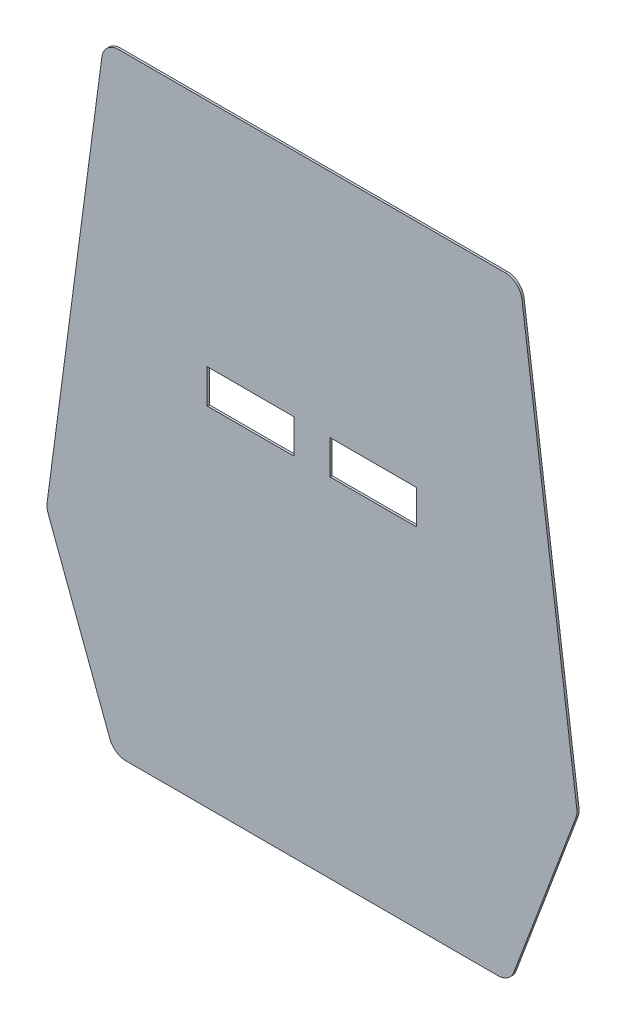
ISO-10303-21;
HEADER;
FILE_DESCRIPTION(('STEP AP214'),'2;1');
FILE_NAME('part.step','',(''),(''),'','','');
FILE_SCHEMA(('AUTOMOTIVE_DESIGN { 1 0 10303 214 1 1 1 1 }'));
ENDSEC;
DATA;
#1=APPLICATION_CONTEXT('core data for automotive mechanical design processes');
#2=APPLICATION_PROTOCOL_DEFINITION('international standard','automotive_design',2000,#1);
#3=PRODUCT_CONTEXT('',#1,'mechanical');
#4=PRODUCT('Part','Part','',(#3));
#5=PRODUCT_RELATED_PRODUCT_CATEGORY('part','',(#4));
#6=PRODUCT_DEFINITION_FORMATION('','',#4);
#7=PRODUCT_DEFINITION_CONTEXT('part definition',#1,'design');
#8=PRODUCT_DEFINITION('design','',#6,#7);
#9=PRODUCT_DEFINITION_SHAPE('','',#8);
#10=(LENGTH_UNIT() NAMED_UNIT(*) SI_UNIT(.MILLI.,.METRE.));
#11=(NAMED_UNIT(*) PLANE_ANGLE_UNIT() SI_UNIT($,.RADIAN.));
#12=(NAMED_UNIT(*) SI_UNIT($,.STERADIAN.) SOLID_ANGLE_UNIT());
#13=UNCERTAINTY_MEASURE_WITH_UNIT(LENGTH_MEASURE(1.E-05),#10,'distance_accuracy_value','');
#14=(GEOMETRIC_REPRESENTATION_CONTEXT(3) GLOBAL_UNCERTAINTY_ASSIGNED_CONTEXT((#13)) GLOBAL_UNIT_ASSIGNED_CONTEXT((#10,
#11,#12)) REPRESENTATION_CONTEXT('',''));
#15=CARTESIAN_POINT('',(0.,0.,0.));
#16=DIRECTION('',(0.,0.,1.));
#17=DIRECTION('',(1.,0.,0.));
#18=AXIS2_PLACEMENT_3D('',#15,#16,#17);
#19=CARTESIAN_POINT('',(0.,0.,-3.175));
#20=DIRECTION('',(0.,0.,1.));
#21=DIRECTION('',(1.,0.,0.));
#22=AXIS2_PLACEMENT_3D('',#19,#20,#21);
#23=PLANE('',#22);
#24=DIRECTION('',(0.352233761299135,-0.935912056446045,0.));
#25=VECTOR('',#24,1.);
#26=CARTESIAN_POINT('',(-389.09,263.21,-3.175));
#27=LINE('',#26,#25);
#28=CARTESIAN_POINT('',(-386.880452975,257.339064481626,-3.175));
#29=VERTEX_POINT('',#28);
#30=CARTESIAN_POINT('',(-296.124726986599,16.1941559675215,-3.175));
#31=VERTEX_POINT('',#30);
#32=EDGE_CURVE('E384',#29,#31,#27,.T.);
#33=ORIENTED_EDGE('',*,*,#32,.F.);
#34=CARTESIAN_POINT('',(-363.482651563849,266.144908514104,-3.175));
#35=DIRECTION('',(0.,0.,1.));
#36=DIRECTION('',(1.,0.,0.));
#37=AXIS2_PLACEMENT_3D('',#34,#35,#36);
#38=CIRCLE('',#37,25.);
#39=CARTESIAN_POINT('',(-388.266059479813,269.428609485712,-3.175));
#40=VERTEX_POINT('',#39);
#41=EDGE_CURVE('E435',#29,#40,#38,.F.);
#42=ORIENTED_EDGE('',*,*,#41,.T.);
#43=DIRECTION('',(-0.131348038864326,-0.991336316638554,0.));
#44=VECTOR('',#43,1.);
#45=CARTESIAN_POINT('',(-305.02,897.72,-3.175));
#46=LINE('',#45,#44);
#47=CARTESIAN_POINT('',(-307.897321491099,876.003700971608,-3.175));
#48=VERTEX_POINT('',#47);
#49=EDGE_CURVE('E381',#48,#40,#46,.T.);
#50=ORIENTED_EDGE('',*,*,#49,.F.);
#51=CARTESIAN_POINT('',(-283.113913575135,872.72,-3.175));
#52=DIRECTION('',(0.,0.,1.));
#53=DIRECTION('',(1.,0.,0.));
#54=AXIS2_PLACEMENT_3D('',#51,#52,#53);
#55=CIRCLE('',#54,25.);
#56=CARTESIAN_POINT('',(-283.113913575135,897.72,-3.175));
#57=VERTEX_POINT('',#56);
#58=EDGE_CURVE('E425',#48,#57,#55,.F.);
#59=ORIENTED_EDGE('',*,*,#58,.T.);
#60=DIRECTION('',(-1.,0.,0.));
#61=VECTOR('',#60,1.);
#62=CARTESIAN_POINT('',(-305.02,897.72,-3.175));
#63=LINE('',#62,#61);
#64=CARTESIAN_POINT('',(283.113913575135,897.72,-3.175));
#65=VERTEX_POINT('',#64);
#66=EDGE_CURVE('E378',#65,#57,#63,.T.);
#67=ORIENTED_EDGE('',*,*,#66,.F.);
#68=CARTESIAN_POINT('',(283.113913575135,872.72,-3.175));
#69=DIRECTION('',(0.,0.,1.));
#70=DIRECTION('',(1.,0.,0.));
#71=AXIS2_PLACEMENT_3D('',#68,#69,#70);
#72=CIRCLE('',#71,25.);
#73=CARTESIAN_POINT('',(307.897321491099,876.003700971608,-3.175));
#74=VERTEX_POINT('',#73);
#75=EDGE_CURVE('E427',#65,#74,#72,.F.);
#76=ORIENTED_EDGE('',*,*,#75,.T.);
#77=DIRECTION('',(-0.131348038864326,0.991336316638554,0.));
#78=VECTOR('',#77,1.);
#79=CARTESIAN_POINT('',(305.02,897.72,-3.175));
#80=LINE('',#79,#78);
#81=CARTESIAN_POINT('',(388.266059479813,269.428609485712,-3.175));
#82=VERTEX_POINT('',#81);
#83=EDGE_CURVE('E375',#82,#74,#80,.T.);
#84=ORIENTED_EDGE('',*,*,#83,.F.);
#85=CARTESIAN_POINT('',(363.482651563849,266.144908514104,-3.175));
#86=DIRECTION('',(0.,0.,1.));
#87=DIRECTION('',(1.,0.,0.));
#88=AXIS2_PLACEMENT_3D('',#85,#86,#87);
#89=CIRCLE('',#88,25.);
#90=CARTESIAN_POINT('',(386.880452975,257.339064481626,-3.175));
#91=VERTEX_POINT('',#90);
#92=EDGE_CURVE('E429',#82,#91,#89,.F.);
#93=ORIENTED_EDGE('',*,*,#92,.T.);
#94=DIRECTION('',(0.352233761299134,0.935912056446045,0.));
#95=VECTOR('',#94,1.);
#96=CARTESIAN_POINT('',(389.09,263.21,-3.175));
#97=LINE('',#96,#95);
#98=CARTESIAN_POINT('',(296.124726986599,16.1941559675215,-3.175));
#99=VERTEX_POINT('',#98);
#100=EDGE_CURVE('E371',#99,#91,#97,.T.);
#101=ORIENTED_EDGE('',*,*,#100,.F.);
#102=CARTESIAN_POINT('',(272.726925575448,25.,-3.175));
#103=DIRECTION('',(0.,0.,1.));
#104=DIRECTION('',(1.,0.,0.));
#105=AXIS2_PLACEMENT_3D('',#102,#103,#104);
#106=CIRCLE('',#105,25.);
#107=CARTESIAN_POINT('',(272.726925575448,0.,-3.175));
#108=VERTEX_POINT('',#107);
#109=EDGE_CURVE('E431',#99,#108,#106,.F.);
#110=ORIENTED_EDGE('',*,*,#109,.T.);
#111=DIRECTION('',(1.,0.,0.));
#112=VECTOR('',#111,1.);
#113=CARTESIAN_POINT('',(290.03,0.,-3.175));
#114=LINE('',#113,#112);
#115=CARTESIAN_POINT('',(-272.726925575448,-1.08903286991572E-13,-3.175));
#116=VERTEX_POINT('',#115);
#117=EDGE_CURVE('E368',#116,#108,#114,.T.);
#118=ORIENTED_EDGE('',*,*,#117,.F.);
#119=CARTESIAN_POINT('',(-272.726925575448,24.9999999999999,-3.175));
#120=DIRECTION('',(0.,0.,1.));
#121=DIRECTION('',(1.,0.,0.));
#122=AXIS2_PLACEMENT_3D('',#119,#120,#121);
#123=CIRCLE('',#122,25.);
#124=EDGE_CURVE('E433',#116,#31,#123,.F.);
#125=ORIENTED_EDGE('',*,*,#124,.T.);
#126=EDGE_LOOP('',(#33,#42,#50,#59,#67,#76,#84,#93,#101,#110,#118,#125));
#127=FACE_BOUND('',#126,.T.);
#128=DIRECTION('',(1.,0.,0.));
#129=VECTOR('',#128,1.);
#130=CARTESIAN_POINT('',(0.,510.,-3.175));
#131=LINE('',#130,#129);
#132=CARTESIAN_POINT('',(26.5000000000002,510.,-3.175));
#133=VERTEX_POINT('',#132);
#134=CARTESIAN_POINT('',(153.5,510.,-3.175));
#135=VERTEX_POINT('',#134);
#136=EDGE_CURVE('E349',#133,#135,#131,.T.);
#137=ORIENTED_EDGE('',*,*,#136,.T.);
#138=DIRECTION('',(0.,1.,0.));
#139=VECTOR('',#138,1.);
#140=CARTESIAN_POINT('',(153.5,0.,-3.175));
#141=LINE('',#140,#139);
#142=CARTESIAN_POINT('',(153.5,560.,-3.175));
#143=VERTEX_POINT('',#142);
#144=EDGE_CURVE('E352',#135,#143,#141,.T.);
#145=ORIENTED_EDGE('',*,*,#144,.T.);
#146=DIRECTION('',(-1.,0.,0.));
#147=VECTOR('',#146,1.);
#148=CARTESIAN_POINT('',(0.,560.,-3.175));
#149=LINE('',#148,#147);
#150=CARTESIAN_POINT('',(26.5000000000002,560.,-3.175));
#151=VERTEX_POINT('',#150);
#152=EDGE_CURVE('E319',#143,#151,#149,.T.);
#153=ORIENTED_EDGE('',*,*,#152,.T.);
#154=DIRECTION('',(0.,-1.,0.));
#155=VECTOR('',#154,1.);
#156=CARTESIAN_POINT('',(26.5000000000003,0.,-3.175));
#157=LINE('',#156,#155);
#158=EDGE_CURVE('E346',#151,#133,#157,.T.);
#159=ORIENTED_EDGE('',*,*,#158,.T.);
#160=EDGE_LOOP('',(#137,#145,#153,#159));
#161=FACE_BOUND('',#160,.T.);
#162=DIRECTION('',(1.,0.,0.));
#163=VECTOR('',#162,1.);
#164=CARTESIAN_POINT('',(0.,510.,-3.175));
#165=LINE('',#164,#163);
#166=CARTESIAN_POINT('',(-153.5,510.,-3.175));
#167=VERTEX_POINT('',#166);
#168=CARTESIAN_POINT('',(-26.5,510.,-3.175));
#169=VERTEX_POINT('',#168);
#170=EDGE_CURVE('E361',#167,#169,#165,.T.);
#171=ORIENTED_EDGE('',*,*,#170,.T.);
#172=DIRECTION('',(0.,1.,0.));
#173=VECTOR('',#172,1.);
#174=CARTESIAN_POINT('',(-26.5,0.,-3.175));
#175=LINE('',#174,#173);
#176=CARTESIAN_POINT('',(-26.5,560.,-3.175));
#177=VERTEX_POINT('',#176);
#178=EDGE_CURVE('E364',#169,#177,#175,.T.);
#179=ORIENTED_EDGE('',*,*,#178,.T.);
#180=DIRECTION('',(-1.,0.,0.));
#181=VECTOR('',#180,1.);
#182=CARTESIAN_POINT('',(0.,560.,-3.175));
#183=LINE('',#182,#181);
#184=CARTESIAN_POINT('',(-153.5,560.,-3.175));
#185=VERTEX_POINT('',#184);
#186=EDGE_CURVE('E355',#177,#185,#183,.T.);
#187=ORIENTED_EDGE('',*,*,#186,.T.);
#188=DIRECTION('',(0.,-1.,0.));
#189=VECTOR('',#188,1.);
#190=CARTESIAN_POINT('',(-153.5,0.,-3.175));
#191=LINE('',#190,#189);
#192=EDGE_CURVE('E358',#185,#167,#191,.T.);
#193=ORIENTED_EDGE('',*,*,#192,.T.);
#194=EDGE_LOOP('',(#171,#179,#187,#193));
#195=FACE_BOUND('',#194,.T.);
#196=DIRECTION('',(0.,1.,0.));
#197=VECTOR('',#196,1.);
#198=CARTESIAN_POINT('',(-50.,735.,-3.175));
#199=LINE('',#198,#197);
#200=CARTESIAN_POINT('',(-50.,635.,-3.175));
#201=VERTEX_POINT('',#200);
#202=CARTESIAN_POINT('',(-50.,735.,-3.175));
#203=VERTEX_POINT('',#202);
#204=EDGE_CURVE('E270',#201,#203,#199,.T.);
#205=ORIENTED_EDGE('',*,*,#204,.F.);
#206=DIRECTION('',(-1.,0.,0.));
#207=VECTOR('',#206,1.);
#208=CARTESIAN_POINT('',(50.,635.,-3.175));
#209=LINE('',#208,#207);
#210=CARTESIAN_POINT('',(50.,635.,-3.175));
#211=VERTEX_POINT('',#210);
#212=EDGE_CURVE('E275',#211,#201,#209,.T.);
#213=ORIENTED_EDGE('',*,*,#212,.F.);
#214=DIRECTION('',(0.,-1.,0.));
#215=VECTOR('',#214,1.);
#216=CARTESIAN_POINT('',(50.,735.,-3.175));
#217=LINE('',#216,#215);
#218=CARTESIAN_POINT('',(50.,735.,-3.175));
#219=VERTEX_POINT('',#218);
#220=EDGE_CURVE('E287',#219,#211,#217,.T.);
#221=ORIENTED_EDGE('',*,*,#220,.F.);
#222=DIRECTION('',(1.,0.,0.));
#223=VECTOR('',#222,1.);
#224=CARTESIAN_POINT('',(50.,735.,-3.175));
#225=LINE('',#224,#223);
#226=EDGE_CURVE('E284',#203,#219,#225,.T.);
#227=ORIENTED_EDGE('',*,*,#226,.F.);
#228=EDGE_LOOP('',(#205,#213,#221,#227));
#229=FACE_BOUND('',#228,.T.);
#230=ADVANCED_FACE('F41',(#127,#161,#195,#229),#23,.F.);
#231=CARTESIAN_POINT('',(290.03,0.,-3.175));
#232=DIRECTION('',(0.,-1.,0.));
#233=DIRECTION('',(1.,0.,0.));
#234=AXIS2_PLACEMENT_3D('',#231,#232,#233);
#235=PLANE('',#234);
#236=DIRECTION('',(1.,0.,0.));
#237=VECTOR('',#236,1.);
#238=CARTESIAN_POINT('',(290.03,0.,0.));
#239=LINE('',#238,#237);
#240=CARTESIAN_POINT('',(-272.726925575448,-1.08903286991572E-13,0.));
#241=VERTEX_POINT('',#240);
#242=CARTESIAN_POINT('',(272.726925575448,0.,0.));
#243=VERTEX_POINT('',#242);
#244=EDGE_CURVE('E367',#241,#243,#239,.T.);
#245=ORIENTED_EDGE('',*,*,#244,.F.);
#246=DIRECTION('',(0.,0.,1.));
#247=VECTOR('',#246,1.);
#248=CARTESIAN_POINT('',(-272.726925575448,-1.08903286991572E-13,-3.175));
#249=LINE('',#248,#247);
#250=EDGE_CURVE('E440',#241,#116,#249,.F.);
#251=ORIENTED_EDGE('',*,*,#250,.T.);
#252=ORIENTED_EDGE('',*,*,#117,.T.);
#253=DIRECTION('',(0.,0.,1.));
#254=VECTOR('',#253,1.);
#255=CARTESIAN_POINT('',(272.726925575448,0.,-3.175));
#256=LINE('',#255,#254);
#257=EDGE_CURVE('E437',#108,#243,#256,.T.);
#258=ORIENTED_EDGE('',*,*,#257,.T.);
#259=EDGE_LOOP('',(#245,#251,#252,#258));
#260=FACE_BOUND('',#259,.T.);
#261=ADVANCED_FACE('F504',(#260),#235,.T.);
#262=CARTESIAN_POINT('',(-389.09,263.21,-3.175));
#263=DIRECTION('',(-0.935912056446045,-0.352233761299135,0.));
#264=DIRECTION('',(0.352233761299135,-0.935912056446045,0.));
#265=AXIS2_PLACEMENT_3D('',#262,#263,#264);
#266=PLANE('',#265);
#267=DIRECTION('',(0.352233761299135,-0.935912056446045,0.));
#268=VECTOR('',#267,1.);
#269=CARTESIAN_POINT('',(-389.09,263.21,0.));
#270=LINE('',#269,#268);
#271=CARTESIAN_POINT('',(-386.880452975,257.339064481626,0.));
#272=VERTEX_POINT('',#271);
#273=CARTESIAN_POINT('',(-296.124726986599,16.1941559675215,0.));
#274=VERTEX_POINT('',#273);
#275=EDGE_CURVE('E372',#272,#274,#270,.T.);
#276=ORIENTED_EDGE('',*,*,#275,.F.);
#277=DIRECTION('',(0.,0.,1.));
#278=VECTOR('',#277,1.);
#279=CARTESIAN_POINT('',(-386.880452975,257.339064481626,-3.175));
#280=LINE('',#279,#278);
#281=EDGE_CURVE('E423',#272,#29,#280,.F.);
#282=ORIENTED_EDGE('',*,*,#281,.T.);
#283=ORIENTED_EDGE('',*,*,#32,.T.);
#284=DIRECTION('',(0.,0.,1.));
#285=VECTOR('',#284,1.);
#286=CARTESIAN_POINT('',(-296.124726986599,16.1941559675215,-3.175));
#287=LINE('',#286,#285);
#288=EDGE_CURVE('E420',#31,#274,#287,.T.);
#289=ORIENTED_EDGE('',*,*,#288,.T.);
#290=EDGE_LOOP('',(#276,#282,#283,#289));
#291=FACE_BOUND('',#290,.T.);
#292=ADVANCED_FACE('F512',(#291),#266,.T.);
#293=CARTESIAN_POINT('',(-305.02,897.72,-3.175));
#294=DIRECTION('',(-0.991336316638554,0.131348038864326,0.));
#295=DIRECTION('',(-0.131348038864326,-0.991336316638554,0.));
#296=AXIS2_PLACEMENT_3D('',#293,#294,#295);
#297=PLANE('',#296);
#298=ORIENTED_EDGE('',*,*,#49,.T.);
#299=DIRECTION('',(0.,0.,1.));
#300=VECTOR('',#299,1.);
#301=CARTESIAN_POINT('',(-388.266059479813,269.428609485712,-3.175));
#302=LINE('',#301,#300);
#303=CARTESIAN_POINT('',(-388.266059479813,269.428609485712,0.));
#304=VERTEX_POINT('',#303);
#305=EDGE_CURVE('E405',#40,#304,#302,.T.);
#306=ORIENTED_EDGE('',*,*,#305,.T.);
#307=DIRECTION('',(-0.131348038864326,-0.991336316638554,0.));
#308=VECTOR('',#307,1.);
#309=CARTESIAN_POINT('',(-305.02,897.72,0.));
#310=LINE('',#309,#308);
#311=CARTESIAN_POINT('',(-307.897321491099,876.003700971608,0.));
#312=VERTEX_POINT('',#311);
#313=EDGE_CURVE('E399',#312,#304,#310,.T.);
#314=ORIENTED_EDGE('',*,*,#313,.F.);
#315=DIRECTION('',(0.,0.,1.));
#316=VECTOR('',#315,1.);
#317=CARTESIAN_POINT('',(-307.897321491099,876.003700971608,-3.175));
#318=LINE('',#317,#316);
#319=EDGE_CURVE('E387',#312,#48,#318,.F.);
#320=ORIENTED_EDGE('',*,*,#319,.T.);
#321=EDGE_LOOP('',(#298,#306,#314,#320));
#322=FACE_BOUND('',#321,.T.);
#323=ADVANCED_FACE('F529',(#322),#297,.T.);
#324=CARTESIAN_POINT('',(-305.02,897.72,-3.175));
#325=DIRECTION('',(0.,1.,0.));
#326=DIRECTION('',(-1.,0.,0.));
#327=AXIS2_PLACEMENT_3D('',#324,#325,#326);
#328=PLANE('',#327);
#329=DIRECTION('',(-1.,0.,0.));
#330=VECTOR('',#329,1.);
#331=CARTESIAN_POINT('',(-305.02,897.72,0.));
#332=LINE('',#331,#330);
#333=CARTESIAN_POINT('',(283.113913575135,897.72,0.));
#334=VERTEX_POINT('',#333);
#335=CARTESIAN_POINT('',(-283.113913575135,897.72,0.));
#336=VERTEX_POINT('',#335);
#337=EDGE_CURVE('E396',#334,#336,#332,.T.);
#338=ORIENTED_EDGE('',*,*,#337,.F.);
#339=DIRECTION('',(0.,0.,1.));
#340=VECTOR('',#339,1.);
#341=CARTESIAN_POINT('',(283.113913575135,897.72,-3.175));
#342=LINE('',#341,#340);
#343=EDGE_CURVE('E455',#334,#65,#342,.F.);
#344=ORIENTED_EDGE('',*,*,#343,.T.);
#345=ORIENTED_EDGE('',*,*,#66,.T.);
#346=DIRECTION('',(0.,0.,1.));
#347=VECTOR('',#346,1.);
#348=CARTESIAN_POINT('',(-283.113913575135,897.72,-3.175));
#349=LINE('',#348,#347);
#350=EDGE_CURVE('E452',#57,#336,#349,.T.);
#351=ORIENTED_EDGE('',*,*,#350,.T.);
#352=EDGE_LOOP('',(#338,#344,#345,#351));
#353=FACE_BOUND('',#352,.T.);
#354=ADVANCED_FACE('F533',(#353),#328,.T.);
#355=CARTESIAN_POINT('',(305.02,897.72,-3.175));
#356=DIRECTION('',(0.991336316638554,0.131348038864326,0.));
#357=DIRECTION('',(-0.131348038864326,0.991336316638554,0.));
#358=AXIS2_PLACEMENT_3D('',#355,#356,#357);
#359=PLANE('',#358);
#360=DIRECTION('',(-0.131348038864326,0.991336316638554,0.));
#361=VECTOR('',#360,1.);
#362=CARTESIAN_POINT('',(305.02,897.72,0.));
#363=LINE('',#362,#361);
#364=CARTESIAN_POINT('',(388.266059479813,269.428609485712,0.));
#365=VERTEX_POINT('',#364);
#366=CARTESIAN_POINT('',(307.897321491099,876.003700971608,0.));
#367=VERTEX_POINT('',#366);
#368=EDGE_CURVE('E393',#365,#367,#363,.T.);
#369=ORIENTED_EDGE('',*,*,#368,.F.);
#370=DIRECTION('',(0.,0.,1.));
#371=VECTOR('',#370,1.);
#372=CARTESIAN_POINT('',(388.266059479813,269.428609485712,-3.175));
#373=LINE('',#372,#371);
#374=EDGE_CURVE('E450',#365,#82,#373,.F.);
#375=ORIENTED_EDGE('',*,*,#374,.T.);
#376=ORIENTED_EDGE('',*,*,#83,.T.);
#377=DIRECTION('',(0.,0.,1.));
#378=VECTOR('',#377,1.);
#379=CARTESIAN_POINT('',(307.897321491099,876.003700971608,-3.175));
#380=LINE('',#379,#378);
#381=EDGE_CURVE('E447',#74,#367,#380,.T.);
#382=ORIENTED_EDGE('',*,*,#381,.T.);
#383=EDGE_LOOP('',(#369,#375,#376,#382));
#384=FACE_BOUND('',#383,.T.);
#385=ADVANCED_FACE('F537',(#384),#359,.T.);
#386=CARTESIAN_POINT('',(389.09,263.21,-3.175));
#387=DIRECTION('',(0.935912056446045,-0.352233761299134,0.));
#388=DIRECTION('',(0.352233761299134,0.935912056446045,0.));
#389=AXIS2_PLACEMENT_3D('',#386,#387,#388);
#390=PLANE('',#389);
#391=DIRECTION('',(0.352233761299134,0.935912056446045,0.));
#392=VECTOR('',#391,1.);
#393=CARTESIAN_POINT('',(389.09,263.21,0.));
#394=LINE('',#393,#392);
#395=CARTESIAN_POINT('',(296.124726986599,16.1941559675215,0.));
#396=VERTEX_POINT('',#395);
#397=CARTESIAN_POINT('',(386.880452975,257.339064481626,0.));
#398=VERTEX_POINT('',#397);
#399=EDGE_CURVE('E390',#396,#398,#394,.T.);
#400=ORIENTED_EDGE('',*,*,#399,.F.);
#401=DIRECTION('',(0.,0.,1.));
#402=VECTOR('',#401,1.);
#403=CARTESIAN_POINT('',(296.124726986599,16.1941559675215,-3.175));
#404=LINE('',#403,#402);
#405=EDGE_CURVE('E445',#396,#99,#404,.F.);
#406=ORIENTED_EDGE('',*,*,#405,.T.);
#407=ORIENTED_EDGE('',*,*,#100,.T.);
#408=DIRECTION('',(0.,0.,1.));
#409=VECTOR('',#408,1.);
#410=CARTESIAN_POINT('',(386.880452975,257.339064481626,-3.175));
#411=LINE('',#410,#409);
#412=EDGE_CURVE('E442',#91,#398,#411,.T.);
#413=ORIENTED_EDGE('',*,*,#412,.T.);
#414=EDGE_LOOP('',(#400,#406,#407,#413));
#415=FACE_BOUND('',#414,.T.);
#416=ADVANCED_FACE('F525',(#415),#390,.T.);
#417=CARTESIAN_POINT('',(0.,0.,0.));
#418=DIRECTION('',(0.,0.,1.));
#419=DIRECTION('',(1.,0.,0.));
#420=AXIS2_PLACEMENT_3D('',#417,#418,#419);
#421=PLANE('',#420);
#422=DIRECTION('',(0.,1.,0.));
#423=VECTOR('',#422,1.);
#424=CARTESIAN_POINT('',(-26.5,560.,0.));
#425=LINE('',#424,#423);
#426=CARTESIAN_POINT('',(-26.5,510.,0.));
#427=VERTEX_POINT('',#426);
#428=CARTESIAN_POINT('',(-26.5,560.,0.));
#429=VERTEX_POINT('',#428);
#430=EDGE_CURVE('E304',#427,#429,#425,.T.);
#431=ORIENTED_EDGE('',*,*,#430,.F.);
#432=DIRECTION('',(1.,0.,0.));
#433=VECTOR('',#432,1.);
#434=CARTESIAN_POINT('',(-153.5,510.,0.));
#435=LINE('',#434,#433);
#436=CARTESIAN_POINT('',(-153.5,510.,0.));
#437=VERTEX_POINT('',#436);
#438=EDGE_CURVE('E313',#437,#427,#435,.T.);
#439=ORIENTED_EDGE('',*,*,#438,.F.);
#440=DIRECTION('',(0.,-1.,0.));
#441=VECTOR('',#440,1.);
#442=CARTESIAN_POINT('',(-153.5,560.,0.));
#443=LINE('',#442,#441);
#444=CARTESIAN_POINT('',(-153.5,560.,0.));
#445=VERTEX_POINT('',#444);
#446=EDGE_CURVE('E310',#445,#437,#443,.T.);
#447=ORIENTED_EDGE('',*,*,#446,.F.);
#448=DIRECTION('',(-1.,0.,0.));
#449=VECTOR('',#448,1.);
#450=CARTESIAN_POINT('',(-153.5,560.,0.));
#451=LINE('',#450,#449);
#452=EDGE_CURVE('E306',#429,#445,#451,.T.);
#453=ORIENTED_EDGE('',*,*,#452,.F.);
#454=EDGE_LOOP('',(#431,#439,#447,#453));
#455=FACE_BOUND('',#454,.T.);
#456=DIRECTION('',(0.,1.,0.));
#457=VECTOR('',#456,1.);
#458=CARTESIAN_POINT('',(153.5,560.,0.));
#459=LINE('',#458,#457);
#460=CARTESIAN_POINT('',(153.5,510.,0.));
#461=VERTEX_POINT('',#460);
#462=CARTESIAN_POINT('',(153.5,560.,0.));
#463=VERTEX_POINT('',#462);
#464=EDGE_CURVE('E303',#461,#463,#459,.T.);
#465=ORIENTED_EDGE('',*,*,#464,.F.);
#466=DIRECTION('',(1.,0.,0.));
#467=VECTOR('',#466,1.);
#468=CARTESIAN_POINT('',(26.5000000000002,510.,0.));
#469=LINE('',#468,#467);
#470=CARTESIAN_POINT('',(26.5000000000002,510.,0.));
#471=VERTEX_POINT('',#470);
#472=EDGE_CURVE('E333',#471,#461,#469,.T.);
#473=ORIENTED_EDGE('',*,*,#472,.F.);
#474=DIRECTION('',(0.,-1.,0.));
#475=VECTOR('',#474,1.);
#476=CARTESIAN_POINT('',(26.5000000000002,560.,0.));
#477=LINE('',#476,#475);
#478=CARTESIAN_POINT('',(26.5000000000002,560.,0.));
#479=VERTEX_POINT('',#478);
#480=EDGE_CURVE('E330',#479,#471,#477,.T.);
#481=ORIENTED_EDGE('',*,*,#480,.F.);
#482=DIRECTION('',(-1.,0.,0.));
#483=VECTOR('',#482,1.);
#484=CARTESIAN_POINT('',(26.5000000000002,560.,0.));
#485=LINE('',#484,#483);
#486=EDGE_CURVE('E327',#463,#479,#485,.T.);
#487=ORIENTED_EDGE('',*,*,#486,.F.);
#488=EDGE_LOOP('',(#465,#473,#481,#487));
#489=FACE_BOUND('',#488,.T.);
#490=ORIENTED_EDGE('',*,*,#313,.T.);
#491=CARTESIAN_POINT('',(-363.482651563849,266.144908514104,0.));
#492=DIRECTION('',(0.,0.,1.));
#493=DIRECTION('',(1.,0.,0.));
#494=AXIS2_PLACEMENT_3D('',#491,#492,#493);
#495=CIRCLE('',#494,25.);
#496=EDGE_CURVE('E418',#304,#272,#495,.T.);
#497=ORIENTED_EDGE('',*,*,#496,.T.);
#498=ORIENTED_EDGE('',*,*,#275,.T.);
#499=CARTESIAN_POINT('',(-272.726925575448,24.9999999999999,0.));
#500=DIRECTION('',(0.,0.,1.));
#501=DIRECTION('',(1.,0.,0.));
#502=AXIS2_PLACEMENT_3D('',#499,#500,#501);
#503=CIRCLE('',#502,25.);
#504=EDGE_CURVE('E416',#274,#241,#503,.T.);
#505=ORIENTED_EDGE('',*,*,#504,.T.);
#506=ORIENTED_EDGE('',*,*,#244,.T.);
#507=CARTESIAN_POINT('',(272.726925575448,25.,0.));
#508=DIRECTION('',(0.,0.,1.));
#509=DIRECTION('',(1.,0.,0.));
#510=AXIS2_PLACEMENT_3D('',#507,#508,#509);
#511=CIRCLE('',#510,25.);
#512=EDGE_CURVE('E414',#243,#396,#511,.T.);
#513=ORIENTED_EDGE('',*,*,#512,.T.);
#514=ORIENTED_EDGE('',*,*,#399,.T.);
#515=CARTESIAN_POINT('',(363.482651563849,266.144908514104,0.));
#516=DIRECTION('',(0.,0.,1.));
#517=DIRECTION('',(1.,0.,0.));
#518=AXIS2_PLACEMENT_3D('',#515,#516,#517);
#519=CIRCLE('',#518,25.);
#520=EDGE_CURVE('E412',#398,#365,#519,.T.);
#521=ORIENTED_EDGE('',*,*,#520,.T.);
#522=ORIENTED_EDGE('',*,*,#368,.T.);
#523=CARTESIAN_POINT('',(283.113913575135,872.72,0.));
#524=DIRECTION('',(0.,0.,1.));
#525=DIRECTION('',(1.,0.,0.));
#526=AXIS2_PLACEMENT_3D('',#523,#524,#525);
#527=CIRCLE('',#526,25.);
#528=EDGE_CURVE('E410',#367,#334,#527,.T.);
#529=ORIENTED_EDGE('',*,*,#528,.T.);
#530=ORIENTED_EDGE('',*,*,#337,.T.);
#531=CARTESIAN_POINT('',(-283.113913575135,872.72,0.));
#532=DIRECTION('',(0.,0.,1.));
#533=DIRECTION('',(1.,0.,0.));
#534=AXIS2_PLACEMENT_3D('',#531,#532,#533);
#535=CIRCLE('',#534,25.);
#536=EDGE_CURVE('E408',#336,#312,#535,.T.);
#537=ORIENTED_EDGE('',*,*,#536,.T.);
#538=EDGE_LOOP('',(#490,#497,#498,#505,#506,#513,#514,#521,#522,#529,#530,#537));
#539=FACE_BOUND('',#538,.T.);
#540=ADVANCED_FACE('F521',(#455,#489,#539),#421,.T.);
#541=CARTESIAN_POINT('',(-363.482651563849,266.144908514104,-3.175));
#542=DIRECTION('',(0.,0.,1.));
#543=DIRECTION('',(1.,0.,0.));
#544=AXIS2_PLACEMENT_3D('',#541,#542,#543);
#545=CYLINDRICAL_SURFACE('',#544,25.);
#546=ORIENTED_EDGE('',*,*,#41,.F.);
#547=ORIENTED_EDGE('',*,*,#281,.F.);
#548=ORIENTED_EDGE('',*,*,#496,.F.);
#549=ORIENTED_EDGE('',*,*,#305,.F.);
#550=EDGE_LOOP('',(#546,#547,#548,#549));
#551=FACE_BOUND('',#550,.T.);
#552=ADVANCED_FACE('F524',(#551),#545,.T.);
#553=CARTESIAN_POINT('',(-272.726925575448,24.9999999999999,-3.175));
#554=DIRECTION('',(0.,0.,1.));
#555=DIRECTION('',(1.,0.,0.));
#556=AXIS2_PLACEMENT_3D('',#553,#554,#555);
#557=CYLINDRICAL_SURFACE('',#556,25.);
#558=ORIENTED_EDGE('',*,*,#124,.F.);
#559=ORIENTED_EDGE('',*,*,#250,.F.);
#560=ORIENTED_EDGE('',*,*,#504,.F.);
#561=ORIENTED_EDGE('',*,*,#288,.F.);
#562=EDGE_LOOP('',(#558,#559,#560,#561));
#563=FACE_BOUND('',#562,.T.);
#564=ADVANCED_FACE('F547',(#563),#557,.T.);
#565=CARTESIAN_POINT('',(272.726925575448,25.,-3.175));
#566=DIRECTION('',(0.,0.,1.));
#567=DIRECTION('',(1.,0.,0.));
#568=AXIS2_PLACEMENT_3D('',#565,#566,#567);
#569=CYLINDRICAL_SURFACE('',#568,25.);
#570=ORIENTED_EDGE('',*,*,#109,.F.);
#571=ORIENTED_EDGE('',*,*,#405,.F.);
#572=ORIENTED_EDGE('',*,*,#512,.F.);
#573=ORIENTED_EDGE('',*,*,#257,.F.);
#574=EDGE_LOOP('',(#570,#571,#572,#573));
#575=FACE_BOUND('',#574,.T.);
#576=ADVANCED_FACE('F551',(#575),#569,.T.);
#577=CARTESIAN_POINT('',(363.482651563849,266.144908514104,-3.175));
#578=DIRECTION('',(0.,0.,1.));
#579=DIRECTION('',(1.,0.,0.));
#580=AXIS2_PLACEMENT_3D('',#577,#578,#579);
#581=CYLINDRICAL_SURFACE('',#580,25.);
#582=ORIENTED_EDGE('',*,*,#92,.F.);
#583=ORIENTED_EDGE('',*,*,#374,.F.);
#584=ORIENTED_EDGE('',*,*,#520,.F.);
#585=ORIENTED_EDGE('',*,*,#412,.F.);
#586=EDGE_LOOP('',(#582,#583,#584,#585));
#587=FACE_BOUND('',#586,.T.);
#588=ADVANCED_FACE('F555',(#587),#581,.T.);
#589=CARTESIAN_POINT('',(283.113913575135,872.72,-3.175));
#590=DIRECTION('',(0.,0.,1.));
#591=DIRECTION('',(1.,0.,0.));
#592=AXIS2_PLACEMENT_3D('',#589,#590,#591);
#593=CYLINDRICAL_SURFACE('',#592,25.);
#594=ORIENTED_EDGE('',*,*,#75,.F.);
#595=ORIENTED_EDGE('',*,*,#343,.F.);
#596=ORIENTED_EDGE('',*,*,#528,.F.);
#597=ORIENTED_EDGE('',*,*,#381,.F.);
#598=EDGE_LOOP('',(#594,#595,#596,#597));
#599=FACE_BOUND('',#598,.T.);
#600=ADVANCED_FACE('F559',(#599),#593,.T.);
#601=CARTESIAN_POINT('',(-283.113913575135,872.72,-3.175));
#602=DIRECTION('',(0.,0.,1.));
#603=DIRECTION('',(1.,0.,0.));
#604=AXIS2_PLACEMENT_3D('',#601,#602,#603);
#605=CYLINDRICAL_SURFACE('',#604,25.);
#606=ORIENTED_EDGE('',*,*,#58,.F.);
#607=ORIENTED_EDGE('',*,*,#319,.F.);
#608=ORIENTED_EDGE('',*,*,#536,.F.);
#609=ORIENTED_EDGE('',*,*,#350,.F.);
#610=EDGE_LOOP('',(#606,#607,#608,#609));
#611=FACE_BOUND('',#610,.T.);
#612=ADVANCED_FACE('F563',(#611),#605,.T.);
#613=CARTESIAN_POINT('',(153.5,560.,-10.));
#614=DIRECTION('',(1.,0.,0.));
#615=DIRECTION('',(0.,0.,-1.));
#616=AXIS2_PLACEMENT_3D('',#613,#614,#615);
#617=PLANE('',#616);
#618=DIRECTION('',(0.,0.,1.));
#619=VECTOR('',#618,1.);
#620=CARTESIAN_POINT('',(153.5,510.,-10.));
#621=LINE('',#620,#619);
#622=EDGE_CURVE('E307',#135,#461,#621,.T.);
#623=ORIENTED_EDGE('',*,*,#622,.T.);
#624=ORIENTED_EDGE('',*,*,#464,.T.);
#625=DIRECTION('',(0.,0.,1.));
#626=VECTOR('',#625,1.);
#627=CARTESIAN_POINT('',(153.5,560.,-10.));
#628=LINE('',#627,#626);
#629=EDGE_CURVE('E336',#143,#463,#628,.T.);
#630=ORIENTED_EDGE('',*,*,#629,.F.);
#631=ORIENTED_EDGE('',*,*,#144,.F.);
#632=EDGE_LOOP('',(#623,#624,#630,#631));
#633=FACE_BOUND('',#632,.T.);
#634=ADVANCED_FACE('F519',(#633),#617,.F.);
#635=CARTESIAN_POINT('',(26.5000000000002,510.,-10.));
#636=DIRECTION('',(0.,-1.,0.));
#637=DIRECTION('',(0.,0.,-1.));
#638=AXIS2_PLACEMENT_3D('',#635,#636,#637);
#639=PLANE('',#638);
#640=DIRECTION('',(0.,0.,1.));
#641=VECTOR('',#640,1.);
#642=CARTESIAN_POINT('',(26.5000000000002,510.,-10.));
#643=LINE('',#642,#641);
#644=EDGE_CURVE('E338',#133,#471,#643,.T.);
#645=ORIENTED_EDGE('',*,*,#644,.T.);
#646=ORIENTED_EDGE('',*,*,#472,.T.);
#647=ORIENTED_EDGE('',*,*,#622,.F.);
#648=ORIENTED_EDGE('',*,*,#136,.F.);
#649=EDGE_LOOP('',(#645,#646,#647,#648));
#650=FACE_BOUND('',#649,.T.);
#651=ADVANCED_FACE('F731',(#650),#639,.F.);
#652=CARTESIAN_POINT('',(26.5000000000002,560.,-10.));
#653=DIRECTION('',(-1.,0.,0.));
#654=DIRECTION('',(0.,-1.,0.));
#655=AXIS2_PLACEMENT_3D('',#652,#653,#654);
#656=PLANE('',#655);
#657=DIRECTION('',(0.,0.,1.));
#658=VECTOR('',#657,1.);
#659=CARTESIAN_POINT('',(26.5000000000002,560.,-10.));
#660=LINE('',#659,#658);
#661=EDGE_CURVE('E340',#151,#479,#660,.T.);
#662=ORIENTED_EDGE('',*,*,#661,.T.);
#663=ORIENTED_EDGE('',*,*,#480,.T.);
#664=ORIENTED_EDGE('',*,*,#644,.F.);
#665=ORIENTED_EDGE('',*,*,#158,.F.);
#666=EDGE_LOOP('',(#662,#663,#664,#665));
#667=FACE_BOUND('',#666,.T.);
#668=ADVANCED_FACE('F724',(#667),#656,.F.);
#669=CARTESIAN_POINT('',(26.5000000000002,560.,-10.));
#670=DIRECTION('',(0.,1.,0.));
#671=DIRECTION('',(0.,0.,1.));
#672=AXIS2_PLACEMENT_3D('',#669,#670,#671);
#673=PLANE('',#672);
#674=ORIENTED_EDGE('',*,*,#629,.T.);
#675=ORIENTED_EDGE('',*,*,#486,.T.);
#676=ORIENTED_EDGE('',*,*,#661,.F.);
#677=ORIENTED_EDGE('',*,*,#152,.F.);
#678=EDGE_LOOP('',(#674,#675,#676,#677));
#679=FACE_BOUND('',#678,.T.);
#680=ADVANCED_FACE('F716',(#679),#673,.F.);
#681=CARTESIAN_POINT('',(-26.5,560.,-10.));
#682=DIRECTION('',(1.,0.,0.));
#683=DIRECTION('',(0.,1.,0.));
#684=AXIS2_PLACEMENT_3D('',#681,#682,#683);
#685=PLANE('',#684);
#686=DIRECTION('',(0.,0.,1.));
#687=VECTOR('',#686,1.);
#688=CARTESIAN_POINT('',(-26.5,510.,-10.));
#689=LINE('',#688,#687);
#690=EDGE_CURVE('E317',#169,#427,#689,.T.);
#691=ORIENTED_EDGE('',*,*,#690,.T.);
#692=ORIENTED_EDGE('',*,*,#430,.T.);
#693=DIRECTION('',(0.,0.,1.));
#694=VECTOR('',#693,1.);
#695=CARTESIAN_POINT('',(-26.5,560.,-10.));
#696=LINE('',#695,#694);
#697=EDGE_CURVE('E316',#177,#429,#696,.T.);
#698=ORIENTED_EDGE('',*,*,#697,.F.);
#699=ORIENTED_EDGE('',*,*,#178,.F.);
#700=EDGE_LOOP('',(#691,#692,#698,#699));
#701=FACE_BOUND('',#700,.T.);
#702=ADVANCED_FACE('F708',(#701),#685,.F.);
#703=CARTESIAN_POINT('',(-153.5,510.,-10.));
#704=DIRECTION('',(0.,-1.,0.));
#705=DIRECTION('',(0.,0.,-1.));
#706=AXIS2_PLACEMENT_3D('',#703,#704,#705);
#707=PLANE('',#706);
#708=DIRECTION('',(0.,0.,1.));
#709=VECTOR('',#708,1.);
#710=CARTESIAN_POINT('',(-153.5,510.,-10.));
#711=LINE('',#710,#709);
#712=EDGE_CURVE('E320',#167,#437,#711,.T.);
#713=ORIENTED_EDGE('',*,*,#712,.T.);
#714=ORIENTED_EDGE('',*,*,#438,.T.);
#715=ORIENTED_EDGE('',*,*,#690,.F.);
#716=ORIENTED_EDGE('',*,*,#170,.F.);
#717=EDGE_LOOP('',(#713,#714,#715,#716));
#718=FACE_BOUND('',#717,.T.);
#719=ADVANCED_FACE('F700',(#718),#707,.F.);
#720=CARTESIAN_POINT('',(-153.5,560.,-10.));
#721=DIRECTION('',(-1.,0.,0.));
#722=DIRECTION('',(0.,0.,1.));
#723=AXIS2_PLACEMENT_3D('',#720,#721,#722);
#724=PLANE('',#723);
#725=DIRECTION('',(0.,0.,1.));
#726=VECTOR('',#725,1.);
#727=CARTESIAN_POINT('',(-153.5,560.,-10.));
#728=LINE('',#727,#726);
#729=EDGE_CURVE('E322',#185,#445,#728,.T.);
#730=ORIENTED_EDGE('',*,*,#729,.T.);
#731=ORIENTED_EDGE('',*,*,#446,.T.);
#732=ORIENTED_EDGE('',*,*,#712,.F.);
#733=ORIENTED_EDGE('',*,*,#192,.F.);
#734=EDGE_LOOP('',(#730,#731,#732,#733));
#735=FACE_BOUND('',#734,.T.);
#736=ADVANCED_FACE('F692',(#735),#724,.F.);
#737=CARTESIAN_POINT('',(-153.5,560.,-10.));
#738=DIRECTION('',(0.,1.,0.));
#739=DIRECTION('',(0.,0.,1.));
#740=AXIS2_PLACEMENT_3D('',#737,#738,#739);
#741=PLANE('',#740);
#742=ORIENTED_EDGE('',*,*,#697,.T.);
#743=ORIENTED_EDGE('',*,*,#452,.T.);
#744=ORIENTED_EDGE('',*,*,#729,.F.);
#745=ORIENTED_EDGE('',*,*,#186,.F.);
#746=EDGE_LOOP('',(#742,#743,#744,#745));
#747=FACE_BOUND('',#746,.T.);
#748=ADVANCED_FACE('F682',(#747),#741,.F.);
#749=CARTESIAN_POINT('',(-50.,735.,-5.175));
#750=DIRECTION('',(1.,0.,0.));
#751=DIRECTION('',(0.,1.,0.));
#752=AXIS2_PLACEMENT_3D('',#749,#750,#751);
#753=PLANE('',#752);
#754=ORIENTED_EDGE('',*,*,#204,.T.);
#755=DIRECTION('',(0.,0.,1.));
#756=VECTOR('',#755,1.);
#757=CARTESIAN_POINT('',(-50.,735.,-5.175));
#758=LINE('',#757,#756);
#759=CARTESIAN_POINT('',(-50.,735.,-5.175));
#760=VERTEX_POINT('',#759);
#761=EDGE_CURVE('E300',#760,#203,#758,.T.);
#762=ORIENTED_EDGE('',*,*,#761,.F.);
#763=DIRECTION('',(0.,1.,0.));
#764=VECTOR('',#763,1.);
#765=CARTESIAN_POINT('',(-50.,735.,-5.175));
#766=LINE('',#765,#764);
#767=CARTESIAN_POINT('',(-50.,635.,-5.175));
#768=VERTEX_POINT('',#767);
#769=EDGE_CURVE('E271',#768,#760,#766,.T.);
#770=ORIENTED_EDGE('',*,*,#769,.F.);
#771=DIRECTION('',(0.,0.,1.));
#772=VECTOR('',#771,1.);
#773=CARTESIAN_POINT('',(-50.,635.,-5.175));
#774=LINE('',#773,#772);
#775=EDGE_CURVE('E281',#768,#201,#774,.T.);
#776=ORIENTED_EDGE('',*,*,#775,.T.);
#777=EDGE_LOOP('',(#754,#762,#770,#776));
#778=FACE_BOUND('',#777,.T.);
#779=ADVANCED_FACE('F673',(#778),#753,.F.);
#780=CARTESIAN_POINT('',(50.,735.,-5.175));
#781=DIRECTION('',(0.,-1.,0.));
#782=DIRECTION('',(0.,0.,-1.));
#783=AXIS2_PLACEMENT_3D('',#780,#781,#782);
#784=PLANE('',#783);
#785=ORIENTED_EDGE('',*,*,#226,.T.);
#786=DIRECTION('',(0.,0.,1.));
#787=VECTOR('',#786,1.);
#788=CARTESIAN_POINT('',(50.,735.,-5.175));
#789=LINE('',#788,#787);
#790=CARTESIAN_POINT('',(50.,735.,-5.175));
#791=VERTEX_POINT('',#790);
#792=EDGE_CURVE('E297',#791,#219,#789,.T.);
#793=ORIENTED_EDGE('',*,*,#792,.F.);
#794=DIRECTION('',(1.,0.,0.));
#795=VECTOR('',#794,1.);
#796=CARTESIAN_POINT('',(50.,735.,-5.175));
#797=LINE('',#796,#795);
#798=EDGE_CURVE('E274',#760,#791,#797,.T.);
#799=ORIENTED_EDGE('',*,*,#798,.F.);
#800=ORIENTED_EDGE('',*,*,#761,.T.);
#801=EDGE_LOOP('',(#785,#793,#799,#800));
#802=FACE_BOUND('',#801,.T.);
#803=ADVANCED_FACE('F664',(#802),#784,.F.);
#804=CARTESIAN_POINT('',(50.,735.,-5.175));
#805=DIRECTION('',(-1.,0.,0.));
#806=DIRECTION('',(0.,-1.,0.));
#807=AXIS2_PLACEMENT_3D('',#804,#805,#806);
#808=PLANE('',#807);
#809=ORIENTED_EDGE('',*,*,#220,.T.);
#810=DIRECTION('',(0.,0.,1.));
#811=VECTOR('',#810,1.);
#812=CARTESIAN_POINT('',(50.,635.,-5.175));
#813=LINE('',#812,#811);
#814=CARTESIAN_POINT('',(50.,635.,-5.175));
#815=VERTEX_POINT('',#814);
#816=EDGE_CURVE('E294',#815,#211,#813,.T.);
#817=ORIENTED_EDGE('',*,*,#816,.F.);
#818=DIRECTION('',(0.,-1.,0.));
#819=VECTOR('',#818,1.);
#820=CARTESIAN_POINT('',(50.,735.,-5.175));
#821=LINE('',#820,#819);
#822=EDGE_CURVE('E277',#791,#815,#821,.T.);
#823=ORIENTED_EDGE('',*,*,#822,.F.);
#824=ORIENTED_EDGE('',*,*,#792,.T.);
#825=EDGE_LOOP('',(#809,#817,#823,#824));
#826=FACE_BOUND('',#825,.T.);
#827=ADVANCED_FACE('F654',(#826),#808,.F.);
#828=CARTESIAN_POINT('',(50.,635.,-5.175));
#829=DIRECTION('',(0.,1.,0.));
#830=DIRECTION('',(0.,0.,1.));
#831=AXIS2_PLACEMENT_3D('',#828,#829,#830);
#832=PLANE('',#831);
#833=ORIENTED_EDGE('',*,*,#212,.T.);
#834=ORIENTED_EDGE('',*,*,#775,.F.);
#835=DIRECTION('',(-1.,0.,0.));
#836=VECTOR('',#835,1.);
#837=CARTESIAN_POINT('',(50.,635.,-5.175));
#838=LINE('',#837,#836);
#839=EDGE_CURVE('E279',#815,#768,#838,.T.);
#840=ORIENTED_EDGE('',*,*,#839,.F.);
#841=ORIENTED_EDGE('',*,*,#816,.T.);
#842=EDGE_LOOP('',(#833,#834,#840,#841));
#843=FACE_BOUND('',#842,.T.);
#844=ADVANCED_FACE('F645',(#843),#832,.F.);
#845=CARTESIAN_POINT('',(0.,0.,-5.175));
#846=DIRECTION('',(0.,0.,-1.));
#847=DIRECTION('',(-1.,0.,0.));
#848=AXIS2_PLACEMENT_3D('',#845,#846,#847);
#849=PLANE('',#848);
#850=DIRECTION('',(0.,1.,0.));
#851=VECTOR('',#850,1.);
#852=CARTESIAN_POINT('',(-45.,730.,-5.175));
#853=LINE('',#852,#851);
#854=CARTESIAN_POINT('',(-45.,640.,-5.175));
#855=VERTEX_POINT('',#854);
#856=CARTESIAN_POINT('',(-45.,730.,-5.175));
#857=VERTEX_POINT('',#856);
#858=EDGE_CURVE('E261',#855,#857,#853,.T.);
#859=ORIENTED_EDGE('',*,*,#858,.F.);
#860=DIRECTION('',(-1.,0.,0.));
#861=VECTOR('',#860,1.);
#862=CARTESIAN_POINT('',(45.,640.,-5.175));
#863=LINE('',#862,#861);
#864=CARTESIAN_POINT('',(45.,640.,-5.175));
#865=VERTEX_POINT('',#864);
#866=EDGE_CURVE('E258',#865,#855,#863,.T.);
#867=ORIENTED_EDGE('',*,*,#866,.F.);
#868=DIRECTION('',(0.,-1.,0.));
#869=VECTOR('',#868,1.);
#870=CARTESIAN_POINT('',(45.,730.,-5.175));
#871=LINE('',#870,#869);
#872=CARTESIAN_POINT('',(45.,730.,-5.175));
#873=VERTEX_POINT('',#872);
#874=EDGE_CURVE('E242',#873,#865,#871,.T.);
#875=ORIENTED_EDGE('',*,*,#874,.F.);
#876=DIRECTION('',(1.,0.,0.));
#877=VECTOR('',#876,1.);
#878=CARTESIAN_POINT('',(45.,730.,-5.175));
#879=LINE('',#878,#877);
#880=EDGE_CURVE('E255',#857,#873,#879,.T.);
#881=ORIENTED_EDGE('',*,*,#880,.F.);
#882=EDGE_LOOP('',(#859,#867,#875,#881));
#883=FACE_BOUND('',#882,.T.);
#884=ORIENTED_EDGE('',*,*,#769,.T.);
#885=ORIENTED_EDGE('',*,*,#798,.T.);
#886=ORIENTED_EDGE('',*,*,#822,.T.);
#887=ORIENTED_EDGE('',*,*,#839,.T.);
#888=EDGE_LOOP('',(#884,#885,#886,#887));
#889=FACE_BOUND('',#888,.T.);
#890=ADVANCED_FACE('F253',(#883,#889),#849,.T.);
#891=CARTESIAN_POINT('',(-45.,730.,-45.175));
#892=DIRECTION('',(1.,0.,0.));
#893=DIRECTION('',(0.,1.,0.));
#894=AXIS2_PLACEMENT_3D('',#891,#892,#893);
#895=PLANE('',#894);
#896=DIRECTION('',(0.,0.,1.));
#897=VECTOR('',#896,1.);
#898=CARTESIAN_POINT('',(-45.,730.,-45.175));
#899=LINE('',#898,#897);
#900=CARTESIAN_POINT('',(-45.,730.,-25.175));
#901=VERTEX_POINT('',#900);
#902=EDGE_CURVE('E246',#901,#857,#899,.T.);
#903=ORIENTED_EDGE('',*,*,#902,.F.);
#904=DIRECTION('',(0.,1.,0.));
#905=VECTOR('',#904,1.);
#906=CARTESIAN_POINT('',(-45.,640.,-25.175));
#907=LINE('',#906,#905);
#908=CARTESIAN_POINT('',(-45.,640.,-25.175));
#909=VERTEX_POINT('',#908);
#910=EDGE_CURVE('E50',#901,#909,#907,.F.);
#911=ORIENTED_EDGE('',*,*,#910,.T.);
#912=DIRECTION('',(0.,0.,1.));
#913=VECTOR('',#912,1.);
#914=CARTESIAN_POINT('',(-45.,640.,-45.175));
#915=LINE('',#914,#913);
#916=EDGE_CURVE('E266',#909,#855,#915,.T.);
#917=ORIENTED_EDGE('',*,*,#916,.T.);
#918=ORIENTED_EDGE('',*,*,#858,.T.);
#919=EDGE_LOOP('',(#903,#911,#917,#918));
#920=FACE_BOUND('',#919,.T.);
#921=ADVANCED_FACE('F628',(#920),#895,.F.);
#922=CARTESIAN_POINT('',(45.,730.,-45.175));
#923=DIRECTION('',(0.,-1.,0.));
#924=DIRECTION('',(0.,0.,-1.));
#925=AXIS2_PLACEMENT_3D('',#922,#923,#924);
#926=PLANE('',#925);
#927=DIRECTION('',(0.,0.,1.));
#928=VECTOR('',#927,1.);
#929=CARTESIAN_POINT('',(45.,730.,-45.175));
#930=LINE('',#929,#928);
#931=CARTESIAN_POINT('',(45.,730.,-25.175));
#932=VERTEX_POINT('',#931);
#933=EDGE_CURVE('E238',#932,#873,#930,.T.);
#934=ORIENTED_EDGE('',*,*,#933,.F.);
#935=DIRECTION('',(1.,0.,0.));
#936=VECTOR('',#935,1.);
#937=CARTESIAN_POINT('',(-45.,730.,-25.175));
#938=LINE('',#937,#936);
#939=EDGE_CURVE('E11',#932,#901,#938,.F.);
#940=ORIENTED_EDGE('',*,*,#939,.T.);
#941=ORIENTED_EDGE('',*,*,#902,.T.);
#942=ORIENTED_EDGE('',*,*,#880,.T.);
#943=EDGE_LOOP('',(#934,#940,#941,#942));
#944=FACE_BOUND('',#943,.T.);
#945=ADVANCED_FACE('F260',(#944),#926,.F.);
#946=CARTESIAN_POINT('',(45.,730.,-45.175));
#947=DIRECTION('',(-1.,0.,0.));
#948=DIRECTION('',(0.,-1.,0.));
#949=AXIS2_PLACEMENT_3D('',#946,#947,#948);
#950=PLANE('',#949);
#951=DIRECTION('',(0.,0.,1.));
#952=VECTOR('',#951,1.);
#953=CARTESIAN_POINT('',(45.,640.,-45.175));
#954=LINE('',#953,#952);
#955=CARTESIAN_POINT('',(45.,640.,-25.175));
#956=VERTEX_POINT('',#955);
#957=EDGE_CURVE('E247',#956,#865,#954,.T.);
#958=ORIENTED_EDGE('',*,*,#957,.F.);
#959=DIRECTION('',(0.,-1.,0.));
#960=VECTOR('',#959,1.);
#961=CARTESIAN_POINT('',(45.,730.,-25.175));
#962=LINE('',#961,#960);
#963=EDGE_CURVE('E244',#956,#932,#962,.F.);
#964=ORIENTED_EDGE('',*,*,#963,.T.);
#965=ORIENTED_EDGE('',*,*,#933,.T.);
#966=ORIENTED_EDGE('',*,*,#874,.T.);
#967=EDGE_LOOP('',(#958,#964,#965,#966));
#968=FACE_BOUND('',#967,.T.);
#969=ADVANCED_FACE('F241',(#968),#950,.F.);
#970=CARTESIAN_POINT('',(45.,640.,-45.175));
#971=DIRECTION('',(0.,1.,0.));
#972=DIRECTION('',(0.,0.,1.));
#973=AXIS2_PLACEMENT_3D('',#970,#971,#972);
#974=PLANE('',#973);
#975=ORIENTED_EDGE('',*,*,#916,.F.);
#976=DIRECTION('',(-1.,0.,0.));
#977=VECTOR('',#976,1.);
#978=CARTESIAN_POINT('',(45.,640.,-25.175));
#979=LINE('',#978,#977);
#980=EDGE_CURVE('E467',#909,#956,#979,.F.);
#981=ORIENTED_EDGE('',*,*,#980,.T.);
#982=ORIENTED_EDGE('',*,*,#957,.T.);
#983=ORIENTED_EDGE('',*,*,#866,.T.);
#984=EDGE_LOOP('',(#975,#981,#982,#983));
#985=FACE_BOUND('',#984,.T.);
#986=ADVANCED_FACE('F490',(#985),#974,.F.);
#987=CARTESIAN_POINT('',(0.,0.,-45.175));
#988=DIRECTION('',(0.,0.,-1.));
#989=DIRECTION('',(-1.,0.,0.));
#990=AXIS2_PLACEMENT_3D('',#987,#988,#989);
#991=PLANE('',#990);
#992=DIRECTION('',(1.,0.,0.));
#993=VECTOR('',#992,1.);
#994=CARTESIAN_POINT('',(45.,710.,-45.175));
#995=LINE('',#994,#993);
#996=CARTESIAN_POINT('',(-25.,710.,-45.175));
#997=VERTEX_POINT('',#996);
#998=CARTESIAN_POINT('',(25.,710.,-45.175));
#999=VERTEX_POINT('',#998);
#1000=EDGE_CURVE('E457',#997,#999,#995,.T.);
#1001=ORIENTED_EDGE('',*,*,#1000,.T.);
#1002=DIRECTION('',(0.,-1.,0.));
#1003=VECTOR('',#1002,1.);
#1004=CARTESIAN_POINT('',(25.,640.,-45.175));
#1005=LINE('',#1004,#1003);
#1006=CARTESIAN_POINT('',(25.,660.,-45.175));
#1007=VERTEX_POINT('',#1006);
#1008=EDGE_CURVE('E463',#999,#1007,#1005,.T.);
#1009=ORIENTED_EDGE('',*,*,#1008,.T.);
#1010=DIRECTION('',(-1.,0.,0.));
#1011=VECTOR('',#1010,1.);
#1012=CARTESIAN_POINT('',(-45.,660.,-45.175));
#1013=LINE('',#1012,#1011);
#1014=CARTESIAN_POINT('',(-25.,660.,-45.175));
#1015=VERTEX_POINT('',#1014);
#1016=EDGE_CURVE('E461',#1007,#1015,#1013,.T.);
#1017=ORIENTED_EDGE('',*,*,#1016,.T.);
#1018=DIRECTION('',(0.,1.,0.));
#1019=VECTOR('',#1018,1.);
#1020=CARTESIAN_POINT('',(-25.,730.,-45.175));
#1021=LINE('',#1020,#1019);
#1022=EDGE_CURVE('E459',#1015,#997,#1021,.T.);
#1023=ORIENTED_EDGE('',*,*,#1022,.T.);
#1024=EDGE_LOOP('',(#1001,#1009,#1017,#1023));
#1025=FACE_BOUND('',#1024,.T.);
#1026=ADVANCED_FACE('F495',(#1025),#991,.T.);
#1027=CARTESIAN_POINT('',(-25.,0.,-25.175));
#1028=DIRECTION('',(0.,-1.,0.));
#1029=DIRECTION('',(1.,0.,0.));
#1030=AXIS2_PLACEMENT_3D('',#1027,#1028,#1029);
#1031=CYLINDRICAL_SURFACE('',#1030,20.);
#1032=CARTESIAN_POINT('',(-25.,660.,-25.175));
#1033=DIRECTION('',(0.707106781186547,-0.707106781186548,0.));
#1034=DIRECTION('',(-0.707106781186547,-0.707106781186547,0.));
#1035=AXIS2_PLACEMENT_3D('',#1032,#1033,#1034);
#1036=ELLIPSE('',#1035,28.2842712474619,20.);
#1037=EDGE_CURVE('E473',#909,#1015,#1036,.T.);
#1038=ORIENTED_EDGE('',*,*,#1037,.F.);
#1039=ORIENTED_EDGE('',*,*,#910,.F.);
#1040=CARTESIAN_POINT('',(-25.,710.,-25.175));
#1041=DIRECTION('',(-0.707106781186547,-0.707106781186547,0.));
#1042=DIRECTION('',(-0.707106781186547,0.707106781186548,0.));
#1043=AXIS2_PLACEMENT_3D('',#1040,#1041,#1042);
#1044=ELLIPSE('',#1043,28.2842712474619,20.);
#1045=EDGE_CURVE('E45',#997,#901,#1044,.F.);
#1046=ORIENTED_EDGE('',*,*,#1045,.F.);
#1047=ORIENTED_EDGE('',*,*,#1022,.F.);
#1048=EDGE_LOOP('',(#1038,#1039,#1046,#1047));
#1049=FACE_BOUND('',#1048,.T.);
#1050=ADVANCED_FACE('F43',(#1049),#1031,.T.);
#1051=CARTESIAN_POINT('',(0.,710.,-25.175));
#1052=DIRECTION('',(-1.,0.,0.));
#1053=DIRECTION('',(0.,0.,1.));
#1054=AXIS2_PLACEMENT_3D('',#1051,#1052,#1053);
#1055=CYLINDRICAL_SURFACE('',#1054,20.);
#1056=ORIENTED_EDGE('',*,*,#1045,.T.);
#1057=ORIENTED_EDGE('',*,*,#939,.F.);
#1058=CARTESIAN_POINT('',(25.,710.,-25.175));
#1059=DIRECTION('',(-0.707106781186547,0.707106781186548,0.));
#1060=DIRECTION('',(-0.707106781186547,-0.707106781186547,0.));
#1061=AXIS2_PLACEMENT_3D('',#1058,#1059,#1060);
#1062=ELLIPSE('',#1061,28.2842712474619,20.);
#1063=EDGE_CURVE('E472',#999,#932,#1062,.F.);
#1064=ORIENTED_EDGE('',*,*,#1063,.F.);
#1065=ORIENTED_EDGE('',*,*,#1000,.F.);
#1066=EDGE_LOOP('',(#1056,#1057,#1064,#1065));
#1067=FACE_BOUND('',#1066,.T.);
#1068=ADVANCED_FACE('F483',(#1067),#1055,.T.);
#1069=CARTESIAN_POINT('',(0.,660.,-25.175));
#1070=DIRECTION('',(1.,0.,0.));
#1071=DIRECTION('',(0.,0.,-1.));
#1072=AXIS2_PLACEMENT_3D('',#1069,#1070,#1071);
#1073=CYLINDRICAL_SURFACE('',#1072,20.);
#1074=ORIENTED_EDGE('',*,*,#1037,.T.);
#1075=ORIENTED_EDGE('',*,*,#1016,.F.);
#1076=CARTESIAN_POINT('',(25.,660.,-25.175));
#1077=DIRECTION('',(0.707106781186547,0.707106781186547,0.));
#1078=DIRECTION('',(0.707106781186547,-0.707106781186548,0.));
#1079=AXIS2_PLACEMENT_3D('',#1076,#1077,#1078);
#1080=ELLIPSE('',#1079,28.2842712474619,20.);
#1081=EDGE_CURVE('E470',#956,#1007,#1080,.T.);
#1082=ORIENTED_EDGE('',*,*,#1081,.F.);
#1083=ORIENTED_EDGE('',*,*,#980,.F.);
#1084=EDGE_LOOP('',(#1074,#1075,#1082,#1083));
#1085=FACE_BOUND('',#1084,.T.);
#1086=ADVANCED_FACE('F488',(#1085),#1073,.T.);
#1087=CARTESIAN_POINT('',(25.,0.,-25.175));
#1088=DIRECTION('',(0.,1.,0.));
#1089=DIRECTION('',(-1.,0.,0.));
#1090=AXIS2_PLACEMENT_3D('',#1087,#1088,#1089);
#1091=CYLINDRICAL_SURFACE('',#1090,20.);
#1092=ORIENTED_EDGE('',*,*,#1063,.T.);
#1093=ORIENTED_EDGE('',*,*,#963,.F.);
#1094=ORIENTED_EDGE('',*,*,#1081,.T.);
#1095=ORIENTED_EDGE('',*,*,#1008,.F.);
#1096=EDGE_LOOP('',(#1092,#1093,#1094,#1095));
#1097=FACE_BOUND('',#1096,.T.);
#1098=ADVANCED_FACE('F492',(#1097),#1091,.T.);
#1099=CLOSED_SHELL('',(#230,#261,#292,#323,#354,#385,#416,#540,#552,#564,#576,#588,#600,#612,
#634,#651,#668,#680,#702,#719,#736,#748,#779,#803,#827,#844,#890,#921,#945,#969,#986,#1026,
#1050,#1068,#1086,#1098));
#1100=MANIFOLD_SOLID_BREP('B2',#1099);
#1101=ADVANCED_BREP_SHAPE_REPRESENTATION('',(#18,#1100),#14);
#1102=SHAPE_DEFINITION_REPRESENTATION(#9,#1101);
ENDSEC;
END-ISO-10303-21;
